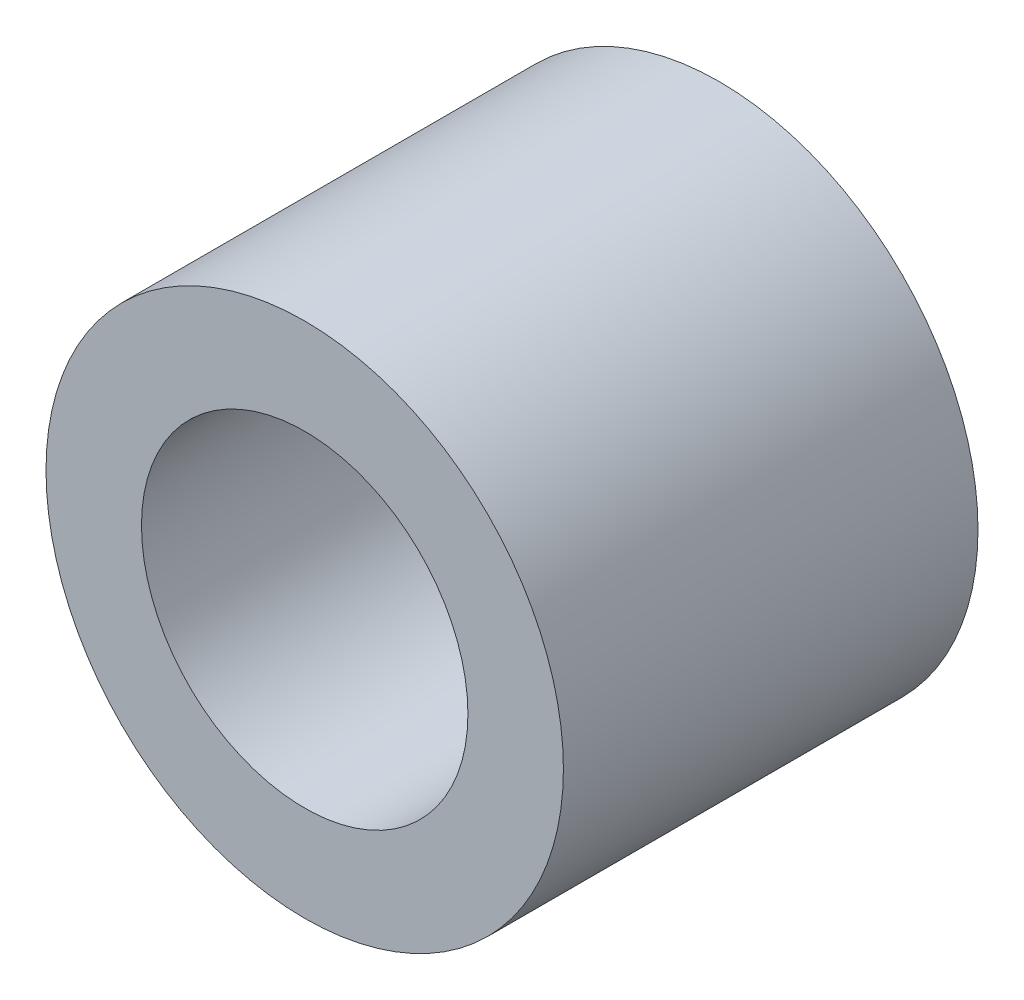
ISO-10303-21;
HEADER;
FILE_DESCRIPTION(('STEP AP214'),'2;1');
FILE_NAME('part.step','',(''),(''),'','','');
FILE_SCHEMA(('AUTOMOTIVE_DESIGN { 1 0 10303 214 1 1 1 1 }'));
ENDSEC;
DATA;
#1=APPLICATION_CONTEXT('core data for automotive mechanical design processes');
#2=APPLICATION_PROTOCOL_DEFINITION('international standard','automotive_design',2000,#1);
#3=PRODUCT_CONTEXT('',#1,'mechanical');
#4=PRODUCT('Part','Part','',(#3));
#5=PRODUCT_RELATED_PRODUCT_CATEGORY('part','',(#4));
#6=PRODUCT_DEFINITION_FORMATION('','',#4);
#7=PRODUCT_DEFINITION_CONTEXT('part definition',#1,'design');
#8=PRODUCT_DEFINITION('design','',#6,#7);
#9=PRODUCT_DEFINITION_SHAPE('','',#8);
#10=(LENGTH_UNIT() NAMED_UNIT(*) SI_UNIT(.MILLI.,.METRE.));
#11=(NAMED_UNIT(*) PLANE_ANGLE_UNIT() SI_UNIT($,.RADIAN.));
#12=(NAMED_UNIT(*) SI_UNIT($,.STERADIAN.) SOLID_ANGLE_UNIT());
#13=UNCERTAINTY_MEASURE_WITH_UNIT(LENGTH_MEASURE(1.E-05),#10,'distance_accuracy_value','');
#14=(GEOMETRIC_REPRESENTATION_CONTEXT(3) GLOBAL_UNCERTAINTY_ASSIGNED_CONTEXT((#13)) GLOBAL_UNIT_ASSIGNED_CONTEXT((#10,
#11,#12)) REPRESENTATION_CONTEXT('',''));
#15=CARTESIAN_POINT('',(0.,0.,0.));
#16=DIRECTION('',(0.,0.,1.));
#17=DIRECTION('',(1.,0.,0.));
#18=AXIS2_PLACEMENT_3D('',#15,#16,#17);
#19=CARTESIAN_POINT('',(0.,0.,6.35));
#20=DIRECTION('',(0.,0.,1.));
#21=DIRECTION('',(1.,0.,0.));
#22=AXIS2_PLACEMENT_3D('',#19,#20,#21);
#23=PLANE('',#22);
#24=CARTESIAN_POINT('',(0.,0.,6.35));
#25=DIRECTION('',(0.,0.,1.));
#26=DIRECTION('',(1.,0.,0.));
#27=AXIS2_PLACEMENT_3D('',#24,#25,#26);
#28=CIRCLE('',#27,3.9624);
#29=CARTESIAN_POINT('',(3.9624,0.,6.35));
#30=VERTEX_POINT('',#29);
#31=EDGE_CURVE('E10',#30,#30,#28,.T.);
#32=ORIENTED_EDGE('',*,*,#31,.T.);
#33=EDGE_LOOP('',(#32));
#34=FACE_BOUND('',#33,.T.);
#35=CARTESIAN_POINT('',(0.,0.,6.35));
#36=DIRECTION('',(0.,0.,1.));
#37=DIRECTION('',(1.,0.,0.));
#38=AXIS2_PLACEMENT_3D('',#35,#36,#37);
#39=CIRCLE('',#38,2.5);
#40=CARTESIAN_POINT('',(2.5,0.,6.35));
#41=VERTEX_POINT('',#40);
#42=EDGE_CURVE('E41',#41,#41,#39,.T.);
#43=ORIENTED_EDGE('',*,*,#42,.F.);
#44=EDGE_LOOP('',(#43));
#45=FACE_BOUND('',#44,.T.);
#46=ADVANCED_FACE('F30',(#34,#45),#23,.T.);
#47=CARTESIAN_POINT('',(0.,0.,0.));
#48=DIRECTION('',(0.,0.,1.));
#49=DIRECTION('',(1.,0.,0.));
#50=AXIS2_PLACEMENT_3D('',#47,#48,#49);
#51=PLANE('',#50);
#52=CARTESIAN_POINT('',(0.,0.,0.));
#53=DIRECTION('',(0.,0.,1.));
#54=DIRECTION('',(1.,0.,0.));
#55=AXIS2_PLACEMENT_3D('',#52,#53,#54);
#56=CIRCLE('',#55,3.9624);
#57=CARTESIAN_POINT('',(3.9624,0.,0.));
#58=VERTEX_POINT('',#57);
#59=EDGE_CURVE('E34',#58,#58,#56,.T.);
#60=ORIENTED_EDGE('',*,*,#59,.F.);
#61=EDGE_LOOP('',(#60));
#62=FACE_BOUND('',#61,.T.);
#63=CARTESIAN_POINT('',(0.,0.,0.));
#64=DIRECTION('',(0.,0.,1.));
#65=DIRECTION('',(1.,0.,0.));
#66=AXIS2_PLACEMENT_3D('',#63,#64,#65);
#67=CIRCLE('',#66,2.5);
#68=CARTESIAN_POINT('',(2.5,0.,0.));
#69=VERTEX_POINT('',#68);
#70=EDGE_CURVE('E43',#69,#69,#67,.T.);
#71=ORIENTED_EDGE('',*,*,#70,.T.);
#72=EDGE_LOOP('',(#71));
#73=FACE_BOUND('',#72,.T.);
#74=ADVANCED_FACE('F53',(#62,#73),#51,.F.);
#75=CARTESIAN_POINT('',(0.,0.,6.35));
#76=DIRECTION('',(0.,0.,-1.));
#77=DIRECTION('',(-1.,0.,0.));
#78=AXIS2_PLACEMENT_3D('',#75,#76,#77);
#79=CYLINDRICAL_SURFACE('',#78,3.9624);
#80=ORIENTED_EDGE('',*,*,#31,.F.);
#81=EDGE_LOOP('',(#80));
#82=FACE_BOUND('',#81,.T.);
#83=ORIENTED_EDGE('',*,*,#59,.T.);
#84=EDGE_LOOP('',(#83));
#85=FACE_BOUND('',#84,.T.);
#86=ADVANCED_FACE('F32',(#82,#85),#79,.T.);
#87=CARTESIAN_POINT('',(0.,0.,6.35));
#88=DIRECTION('',(0.,0.,-1.));
#89=DIRECTION('',(-1.,0.,0.));
#90=AXIS2_PLACEMENT_3D('',#87,#88,#89);
#91=CYLINDRICAL_SURFACE('',#90,2.5);
#92=ORIENTED_EDGE('',*,*,#42,.T.);
#93=EDGE_LOOP('',(#92));
#94=FACE_BOUND('',#93,.T.);
#95=ORIENTED_EDGE('',*,*,#70,.F.);
#96=EDGE_LOOP('',(#95));
#97=FACE_BOUND('',#96,.T.);
#98=ADVANCED_FACE('F49',(#94,#97),#91,.F.);
#99=CLOSED_SHELL('',(#46,#74,#86,#98));
#100=MANIFOLD_SOLID_BREP('B2',#99);
#101=ADVANCED_BREP_SHAPE_REPRESENTATION('',(#18,#100),#14);
#102=SHAPE_DEFINITION_REPRESENTATION(#9,#101);
ENDSEC;
END-ISO-10303-21;
